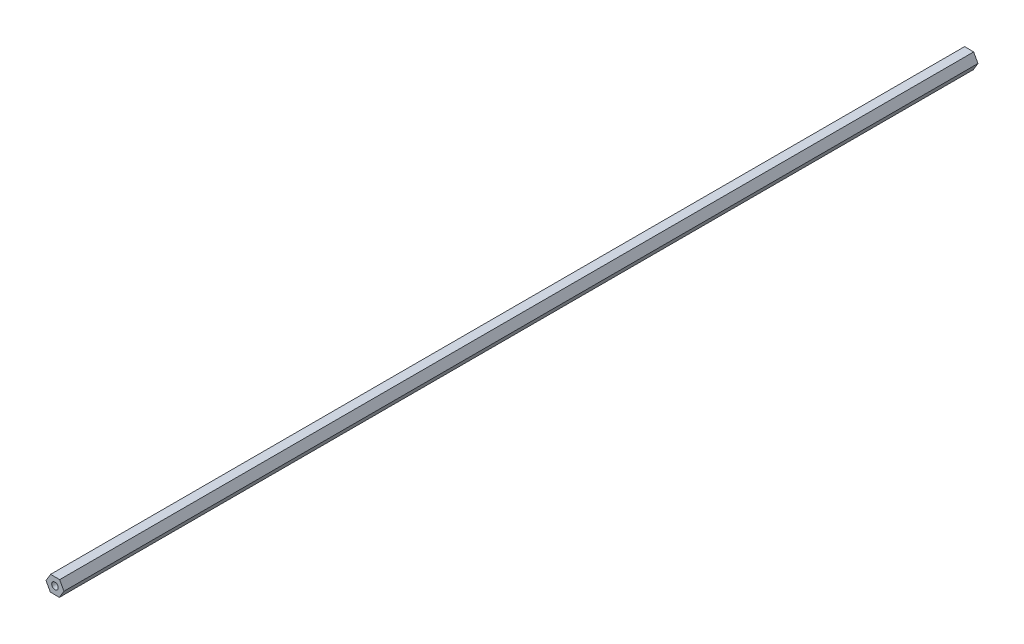
ISO-10303-21;
HEADER;
FILE_DESCRIPTION(('STEP AP214'),'2;1');
FILE_NAME('part.step','',(''),(''),'','','');
FILE_SCHEMA(('AUTOMOTIVE_DESIGN { 1 0 10303 214 1 1 1 1 }'));
ENDSEC;
DATA;
#1=APPLICATION_CONTEXT('core data for automotive mechanical design processes');
#2=APPLICATION_PROTOCOL_DEFINITION('international standard','automotive_design',2000,#1);
#3=PRODUCT_CONTEXT('',#1,'mechanical');
#4=PRODUCT('Part','Part','',(#3));
#5=PRODUCT_RELATED_PRODUCT_CATEGORY('part','',(#4));
#6=PRODUCT_DEFINITION_FORMATION('','',#4);
#7=PRODUCT_DEFINITION_CONTEXT('part definition',#1,'design');
#8=PRODUCT_DEFINITION('design','',#6,#7);
#9=PRODUCT_DEFINITION_SHAPE('','',#8);
#10=(LENGTH_UNIT() NAMED_UNIT(*) SI_UNIT(.MILLI.,.METRE.));
#11=(NAMED_UNIT(*) PLANE_ANGLE_UNIT() SI_UNIT($,.RADIAN.));
#12=(NAMED_UNIT(*) SI_UNIT($,.STERADIAN.) SOLID_ANGLE_UNIT());
#13=UNCERTAINTY_MEASURE_WITH_UNIT(LENGTH_MEASURE(1.E-05),#10,'distance_accuracy_value','');
#14=(GEOMETRIC_REPRESENTATION_CONTEXT(3) GLOBAL_UNCERTAINTY_ASSIGNED_CONTEXT((#13)) GLOBAL_UNIT_ASSIGNED_CONTEXT((#10,
#11,#12)) REPRESENTATION_CONTEXT('',''));
#15=CARTESIAN_POINT('',(0.,0.,0.));
#16=DIRECTION('',(0.,0.,1.));
#17=DIRECTION('',(1.,0.,0.));
#18=AXIS2_PLACEMENT_3D('',#15,#16,#17);
#19=CARTESIAN_POINT('',(0.,0.,746.76));
#20=DIRECTION('',(0.,0.,1.));
#21=DIRECTION('',(1.,0.,0.));
#22=AXIS2_PLACEMENT_3D('',#19,#20,#21);
#23=PLANE('',#22);
#24=DIRECTION('',(0.999847669317632,-0.0174538866760075,0.));
#25=VECTOR('',#24,1.);
#26=CARTESIAN_POINT('',(-3.77644791892778,-6.2850437109824,746.76));
#27=LINE('',#26,#25);
#28=CARTESIAN_POINT('',(-3.77644791892778,-6.2850437109824,746.76));
#29=VERTEX_POINT('',#28);
#30=CARTESIAN_POINT('',(3.55478355814249,-6.41302168935153,746.76));
#31=VERTEX_POINT('',#30);
#32=EDGE_CURVE('E152',#29,#31,#27,.T.);
#33=ORIENTED_EDGE('',*,*,#32,.T.);
#34=DIRECTION('',(0.515039343915013,0.857166538205729,0.));
#35=VECTOR('',#34,1.);
#36=CARTESIAN_POINT('',(3.55478355814249,-6.41302168935153,746.76));
#37=LINE('',#36,#35);
#38=CARTESIAN_POINT('',(7.33123147707026,-0.127977978369134,746.76));
#39=VERTEX_POINT('',#38);
#40=EDGE_CURVE('E100',#31,#39,#37,.T.);
#41=ORIENTED_EDGE('',*,*,#40,.T.);
#42=DIRECTION('',(-0.484808325402619,0.874620424881736,0.));
#43=VECTOR('',#42,1.);
#44=CARTESIAN_POINT('',(7.33123147707026,-0.127977978369134,746.76));
#45=LINE('',#44,#43);
#46=CARTESIAN_POINT('',(3.77644791892777,6.2850437109824,746.76));
#47=VERTEX_POINT('',#46);
#48=EDGE_CURVE('E113',#39,#47,#45,.T.);
#49=ORIENTED_EDGE('',*,*,#48,.T.);
#50=DIRECTION('',(-0.999847669317632,0.0174538866760075,0.));
#51=VECTOR('',#50,1.);
#52=CARTESIAN_POINT('',(3.77644791892777,6.2850437109824,746.76));
#53=LINE('',#52,#51);
#54=CARTESIAN_POINT('',(-3.55478355814248,6.41302168935153,746.76));
#55=VERTEX_POINT('',#54);
#56=EDGE_CURVE('E107',#47,#55,#53,.T.);
#57=ORIENTED_EDGE('',*,*,#56,.T.);
#58=DIRECTION('',(-0.515039343915014,-0.857166538205728,0.));
#59=VECTOR('',#58,1.);
#60=CARTESIAN_POINT('',(-3.55478355814248,6.41302168935153,746.76));
#61=LINE('',#60,#59);
#62=CARTESIAN_POINT('',(-7.33123147707027,0.127977978369134,746.76));
#63=VERTEX_POINT('',#62);
#64=EDGE_CURVE('E111',#55,#63,#61,.T.);
#65=ORIENTED_EDGE('',*,*,#64,.T.);
#66=DIRECTION('',(0.484808325402619,-0.874620424881736,0.));
#67=VECTOR('',#66,1.);
#68=CARTESIAN_POINT('',(-7.33123147707027,0.127977978369134,746.76));
#69=LINE('',#68,#67);
#70=EDGE_CURVE('E63',#63,#29,#69,.T.);
#71=ORIENTED_EDGE('',*,*,#70,.T.);
#72=EDGE_LOOP('',(#33,#41,#49,#57,#65,#71));
#73=FACE_BOUND('',#72,.T.);
#74=CARTESIAN_POINT('',(0.,0.,746.76));
#75=DIRECTION('',(0.,0.,1.));
#76=DIRECTION('',(1.,0.,0.));
#77=AXIS2_PLACEMENT_3D('',#74,#75,#76);
#78=CIRCLE('',#77,2.667);
#79=CARTESIAN_POINT('',(-2.667,0.,746.76));
#80=VERTEX_POINT('',#79);
#81=EDGE_CURVE('E140',#80,#80,#78,.T.);
#82=ORIENTED_EDGE('',*,*,#81,.F.);
#83=EDGE_LOOP('',(#82));
#84=FACE_BOUND('',#83,.T.);
#85=ADVANCED_FACE('F45',(#73,#84),#23,.T.);
#86=CARTESIAN_POINT('',(0.,0.,0.));
#87=DIRECTION('',(0.,0.,1.));
#88=DIRECTION('',(1.,0.,0.));
#89=AXIS2_PLACEMENT_3D('',#86,#87,#88);
#90=PLANE('',#89);
#91=DIRECTION('',(0.999847669317632,-0.0174538866760075,0.));
#92=VECTOR('',#91,1.);
#93=CARTESIAN_POINT('',(-3.77644791892778,-6.2850437109824,0.));
#94=LINE('',#93,#92);
#95=CARTESIAN_POINT('',(-3.77644791892778,-6.2850437109824,0.));
#96=VERTEX_POINT('',#95);
#97=CARTESIAN_POINT('',(3.55478355814249,-6.41302168935153,0.));
#98=VERTEX_POINT('',#97);
#99=EDGE_CURVE('E135',#96,#98,#94,.T.);
#100=ORIENTED_EDGE('',*,*,#99,.F.);
#101=DIRECTION('',(0.484808325402619,-0.874620424881736,0.));
#102=VECTOR('',#101,1.);
#103=CARTESIAN_POINT('',(-7.33123147707027,0.127977978369134,0.));
#104=LINE('',#103,#102);
#105=CARTESIAN_POINT('',(-7.33123147707027,0.127977978369134,0.));
#106=VERTEX_POINT('',#105);
#107=EDGE_CURVE('E92',#106,#96,#104,.T.);
#108=ORIENTED_EDGE('',*,*,#107,.F.);
#109=DIRECTION('',(-0.515039343915014,-0.857166538205728,0.));
#110=VECTOR('',#109,1.);
#111=CARTESIAN_POINT('',(-3.55478355814248,6.41302168935153,0.));
#112=LINE('',#111,#110);
#113=CARTESIAN_POINT('',(-3.55478355814248,6.41302168935153,0.));
#114=VERTEX_POINT('',#113);
#115=EDGE_CURVE('E86',#114,#106,#112,.T.);
#116=ORIENTED_EDGE('',*,*,#115,.F.);
#117=DIRECTION('',(-0.999847669317632,0.0174538866760075,0.));
#118=VECTOR('',#117,1.);
#119=CARTESIAN_POINT('',(3.77644791892777,6.2850437109824,0.));
#120=LINE('',#119,#118);
#121=CARTESIAN_POINT('',(3.77644791892777,6.2850437109824,0.));
#122=VERTEX_POINT('',#121);
#123=EDGE_CURVE('E122',#122,#114,#120,.T.);
#124=ORIENTED_EDGE('',*,*,#123,.F.);
#125=DIRECTION('',(-0.484808325402619,0.874620424881736,0.));
#126=VECTOR('',#125,1.);
#127=CARTESIAN_POINT('',(7.33123147707026,-0.127977978369134,0.));
#128=LINE('',#127,#126);
#129=CARTESIAN_POINT('',(7.33123147707026,-0.127977978369134,0.));
#130=VERTEX_POINT('',#129);
#131=EDGE_CURVE('E143',#130,#122,#128,.T.);
#132=ORIENTED_EDGE('',*,*,#131,.F.);
#133=DIRECTION('',(0.515039343915013,0.857166538205729,0.));
#134=VECTOR('',#133,1.);
#135=CARTESIAN_POINT('',(3.55478355814249,-6.41302168935153,0.));
#136=LINE('',#135,#134);
#137=EDGE_CURVE('E139',#98,#130,#136,.T.);
#138=ORIENTED_EDGE('',*,*,#137,.F.);
#139=EDGE_LOOP('',(#100,#108,#116,#124,#132,#138));
#140=FACE_BOUND('',#139,.T.);
#141=CARTESIAN_POINT('',(0.,0.,0.));
#142=DIRECTION('',(0.,0.,1.));
#143=DIRECTION('',(1.,0.,0.));
#144=AXIS2_PLACEMENT_3D('',#141,#142,#143);
#145=CIRCLE('',#144,2.667);
#146=CARTESIAN_POINT('',(-2.667,0.,0.));
#147=VERTEX_POINT('',#146);
#148=EDGE_CURVE('E249',#147,#147,#145,.T.);
#149=ORIENTED_EDGE('',*,*,#148,.T.);
#150=EDGE_LOOP('',(#149));
#151=FACE_BOUND('',#150,.T.);
#152=ADVANCED_FACE('F165',(#140,#151),#90,.F.);
#153=CARTESIAN_POINT('',(-3.77644791892778,-6.2850437109824,746.76));
#154=DIRECTION('',(0.0174538866760075,0.999847669317632,0.));
#155=DIRECTION('',(-0.999847669317632,0.0174538866760075,0.));
#156=AXIS2_PLACEMENT_3D('',#153,#154,#155);
#157=PLANE('',#156);
#158=ORIENTED_EDGE('',*,*,#99,.T.);
#159=DIRECTION('',(0.,0.,-1.));
#160=VECTOR('',#159,1.);
#161=CARTESIAN_POINT('',(3.55478355814249,-6.41302168935153,746.76));
#162=LINE('',#161,#160);
#163=EDGE_CURVE('E11',#31,#98,#162,.T.);
#164=ORIENTED_EDGE('',*,*,#163,.F.);
#165=ORIENTED_EDGE('',*,*,#32,.F.);
#166=DIRECTION('',(0.,0.,-1.));
#167=VECTOR('',#166,1.);
#168=CARTESIAN_POINT('',(-3.77644791892778,-6.2850437109824,746.76));
#169=LINE('',#168,#167);
#170=EDGE_CURVE('E131',#29,#96,#169,.T.);
#171=ORIENTED_EDGE('',*,*,#170,.T.);
#172=EDGE_LOOP('',(#158,#164,#165,#171));
#173=FACE_BOUND('',#172,.T.);
#174=ADVANCED_FACE('F47',(#173),#157,.F.);
#175=CARTESIAN_POINT('',(3.55478355814249,-6.41302168935153,746.76));
#176=DIRECTION('',(-0.857166538205729,0.515039343915013,0.));
#177=DIRECTION('',(-0.515039343915013,-0.857166538205729,0.));
#178=AXIS2_PLACEMENT_3D('',#175,#176,#177);
#179=PLANE('',#178);
#180=ORIENTED_EDGE('',*,*,#137,.T.);
#181=DIRECTION('',(0.,0.,-1.));
#182=VECTOR('',#181,1.);
#183=CARTESIAN_POINT('',(7.33123147707026,-0.127977978369134,746.76));
#184=LINE('',#183,#182);
#185=EDGE_CURVE('E55',#39,#130,#184,.T.);
#186=ORIENTED_EDGE('',*,*,#185,.F.);
#187=ORIENTED_EDGE('',*,*,#40,.F.);
#188=ORIENTED_EDGE('',*,*,#163,.T.);
#189=EDGE_LOOP('',(#180,#186,#187,#188));
#190=FACE_BOUND('',#189,.T.);
#191=ADVANCED_FACE('F190',(#190),#179,.F.);
#192=CARTESIAN_POINT('',(7.33123147707026,-0.127977978369134,746.76));
#193=DIRECTION('',(-0.874620424881736,-0.484808325402619,0.));
#194=DIRECTION('',(0.484808325402619,-0.874620424881736,0.));
#195=AXIS2_PLACEMENT_3D('',#192,#193,#194);
#196=PLANE('',#195);
#197=ORIENTED_EDGE('',*,*,#131,.T.);
#198=DIRECTION('',(0.,0.,-1.));
#199=VECTOR('',#198,1.);
#200=CARTESIAN_POINT('',(3.77644791892777,6.2850437109824,746.76));
#201=LINE('',#200,#199);
#202=EDGE_CURVE('E124',#47,#122,#201,.T.);
#203=ORIENTED_EDGE('',*,*,#202,.F.);
#204=ORIENTED_EDGE('',*,*,#48,.F.);
#205=ORIENTED_EDGE('',*,*,#185,.T.);
#206=EDGE_LOOP('',(#197,#203,#204,#205));
#207=FACE_BOUND('',#206,.T.);
#208=ADVANCED_FACE('F162',(#207),#196,.F.);
#209=CARTESIAN_POINT('',(3.77644791892777,6.2850437109824,746.76));
#210=DIRECTION('',(-0.0174538866760075,-0.999847669317632,0.));
#211=DIRECTION('',(0.999847669317632,-0.0174538866760075,0.));
#212=AXIS2_PLACEMENT_3D('',#209,#210,#211);
#213=PLANE('',#212);
#214=ORIENTED_EDGE('',*,*,#123,.T.);
#215=DIRECTION('',(0.,0.,-1.));
#216=VECTOR('',#215,1.);
#217=CARTESIAN_POINT('',(-3.55478355814248,6.41302168935153,746.76));
#218=LINE('',#217,#216);
#219=EDGE_CURVE('E119',#55,#114,#218,.T.);
#220=ORIENTED_EDGE('',*,*,#219,.F.);
#221=ORIENTED_EDGE('',*,*,#56,.F.);
#222=ORIENTED_EDGE('',*,*,#202,.T.);
#223=EDGE_LOOP('',(#214,#220,#221,#222));
#224=FACE_BOUND('',#223,.T.);
#225=ADVANCED_FACE('F120',(#224),#213,.F.);
#226=CARTESIAN_POINT('',(-3.55478355814248,6.41302168935153,746.76));
#227=DIRECTION('',(0.857166538205728,-0.515039343915014,0.));
#228=DIRECTION('',(0.515039343915014,0.857166538205728,0.));
#229=AXIS2_PLACEMENT_3D('',#226,#227,#228);
#230=PLANE('',#229);
#231=ORIENTED_EDGE('',*,*,#115,.T.);
#232=DIRECTION('',(0.,0.,-1.));
#233=VECTOR('',#232,1.);
#234=CARTESIAN_POINT('',(-7.33123147707027,0.127977978369134,746.76));
#235=LINE('',#234,#233);
#236=EDGE_CURVE('E125',#63,#106,#235,.T.);
#237=ORIENTED_EDGE('',*,*,#236,.F.);
#238=ORIENTED_EDGE('',*,*,#64,.F.);
#239=ORIENTED_EDGE('',*,*,#219,.T.);
#240=EDGE_LOOP('',(#231,#237,#238,#239));
#241=FACE_BOUND('',#240,.T.);
#242=ADVANCED_FACE('F127',(#241),#230,.F.);
#243=CARTESIAN_POINT('',(-7.33123147707027,0.127977978369134,746.76));
#244=DIRECTION('',(0.874620424881736,0.484808325402619,0.));
#245=DIRECTION('',(-0.484808325402619,0.874620424881736,0.));
#246=AXIS2_PLACEMENT_3D('',#243,#244,#245);
#247=PLANE('',#246);
#248=ORIENTED_EDGE('',*,*,#107,.T.);
#249=ORIENTED_EDGE('',*,*,#170,.F.);
#250=ORIENTED_EDGE('',*,*,#70,.F.);
#251=ORIENTED_EDGE('',*,*,#236,.T.);
#252=EDGE_LOOP('',(#248,#249,#250,#251));
#253=FACE_BOUND('',#252,.T.);
#254=ADVANCED_FACE('F170',(#253),#247,.F.);
#255=CARTESIAN_POINT('',(0.,0.,746.76));
#256=DIRECTION('',(0.,0.,-1.));
#257=DIRECTION('',(-1.,0.,0.));
#258=AXIS2_PLACEMENT_3D('',#255,#256,#257);
#259=CYLINDRICAL_SURFACE('',#258,2.667);
#260=CARTESIAN_POINT('',(-2.667,0.,746.76));
#261=CARTESIAN_POINT('',(-2.667,0.,738.98125));
#262=CARTESIAN_POINT('',(-2.667,0.,731.2025));
#263=CARTESIAN_POINT('',(-2.667,0.,715.645));
#264=CARTESIAN_POINT('',(-2.667,0.,707.86625));
#265=CARTESIAN_POINT('',(-2.667,0.,692.30875));
#266=CARTESIAN_POINT('',(-2.667,0.,684.53));
#267=CARTESIAN_POINT('',(-2.667,0.,668.9725));
#268=CARTESIAN_POINT('',(-2.667,0.,661.19375));
#269=CARTESIAN_POINT('',(-2.667,0.,645.63625));
#270=CARTESIAN_POINT('',(-2.667,0.,637.8575));
#271=CARTESIAN_POINT('',(-2.667,0.,622.3));
#272=CARTESIAN_POINT('',(-2.667,0.,614.52125));
#273=CARTESIAN_POINT('',(-2.667,0.,598.96375));
#274=CARTESIAN_POINT('',(-2.667,0.,591.185));
#275=CARTESIAN_POINT('',(-2.667,0.,575.6275));
#276=CARTESIAN_POINT('',(-2.667,0.,567.84875));
#277=CARTESIAN_POINT('',(-2.667,0.,552.29125));
#278=CARTESIAN_POINT('',(-2.667,0.,544.5125));
#279=CARTESIAN_POINT('',(-2.667,0.,528.955));
#280=CARTESIAN_POINT('',(-2.667,0.,521.17625));
#281=CARTESIAN_POINT('',(-2.667,0.,505.61875));
#282=CARTESIAN_POINT('',(-2.667,0.,497.84));
#283=CARTESIAN_POINT('',(-2.667,0.,482.2825));
#284=CARTESIAN_POINT('',(-2.667,0.,474.50375));
#285=CARTESIAN_POINT('',(-2.667,0.,458.94625));
#286=CARTESIAN_POINT('',(-2.667,0.,451.1675));
#287=CARTESIAN_POINT('',(-2.667,0.,435.61));
#288=CARTESIAN_POINT('',(-2.667,0.,427.83125));
#289=CARTESIAN_POINT('',(-2.667,0.,412.27375));
#290=CARTESIAN_POINT('',(-2.667,0.,404.495));
#291=CARTESIAN_POINT('',(-2.667,0.,388.9375));
#292=CARTESIAN_POINT('',(-2.667,0.,381.15875));
#293=CARTESIAN_POINT('',(-2.667,0.,365.60125));
#294=CARTESIAN_POINT('',(-2.667,0.,357.8225));
#295=CARTESIAN_POINT('',(-2.667,0.,342.265));
#296=CARTESIAN_POINT('',(-2.667,0.,334.48625));
#297=CARTESIAN_POINT('',(-2.667,0.,318.92875));
#298=CARTESIAN_POINT('',(-2.667,0.,311.15));
#299=CARTESIAN_POINT('',(-2.667,0.,295.5925));
#300=CARTESIAN_POINT('',(-2.667,0.,287.81375));
#301=CARTESIAN_POINT('',(-2.667,0.,272.25625));
#302=CARTESIAN_POINT('',(-2.667,0.,264.4775));
#303=CARTESIAN_POINT('',(-2.667,0.,248.92));
#304=CARTESIAN_POINT('',(-2.667,0.,241.14125));
#305=CARTESIAN_POINT('',(-2.667,0.,225.58375));
#306=CARTESIAN_POINT('',(-2.667,0.,217.805));
#307=CARTESIAN_POINT('',(-2.667,0.,202.2475));
#308=CARTESIAN_POINT('',(-2.667,0.,194.46875));
#309=CARTESIAN_POINT('',(-2.667,0.,178.91125));
#310=CARTESIAN_POINT('',(-2.667,0.,171.1325));
#311=CARTESIAN_POINT('',(-2.667,0.,155.575));
#312=CARTESIAN_POINT('',(-2.667,0.,147.79625));
#313=CARTESIAN_POINT('',(-2.667,0.,132.23875));
#314=CARTESIAN_POINT('',(-2.667,0.,124.46));
#315=CARTESIAN_POINT('',(-2.667,0.,108.9025));
#316=CARTESIAN_POINT('',(-2.667,0.,101.12375));
#317=CARTESIAN_POINT('',(-2.667,0.,85.56625));
#318=CARTESIAN_POINT('',(-2.667,0.,77.7875));
#319=CARTESIAN_POINT('',(-2.667,0.,62.23));
#320=CARTESIAN_POINT('',(-2.667,0.,54.45125));
#321=CARTESIAN_POINT('',(-2.667,0.,38.89375));
#322=CARTESIAN_POINT('',(-2.667,0.,31.115));
#323=CARTESIAN_POINT('',(-2.667,0.,15.5575));
#324=CARTESIAN_POINT('',(-2.667,0.,7.77875000000002));
#325=CARTESIAN_POINT('',(-2.667,0.,0.));
#326=B_SPLINE_CURVE_WITH_KNOTS('',3,(#260,#261,#262,#263,#264,#265,#266,#267,#268,#269,#270,
#271,#272,#273,#274,#275,#276,#277,#278,#279,#280,#281,#282,#283,#284,#285,#286,#287,#288,#289,
#290,#291,#292,#293,#294,#295,#296,#297,#298,#299,#300,#301,#302,#303,#304,#305,#306,#307,#308,
#309,#310,#311,#312,#313,#314,#315,#316,#317,#318,#319,#320,#321,#322,#323,#324,#325),
.UNSPECIFIED.,.F.,.F.,(4,2,2,2,2,2,2,2,2,2,2,2,2,2,2,2,2,2,2,2,2,2,2,2,2,2,2,2,2,2,2,2,4),(0.,
23.3362500000001,46.6725,70.0087500000001,93.345,116.68125,140.0175,163.35375,186.69,210.02625,
233.3625,256.69875,280.035,303.37125,326.7075,350.04375,373.38,396.71625,420.0525,443.38875,
466.725,490.06125,513.3975,536.73375,560.07,583.40625,606.7425,630.07875,653.415,676.75125,
700.0875,723.42375,746.76),.UNSPECIFIED.);
#327=EDGE_CURVE('BSEAM172',#80,#147,#326,.T.);
#328=ORIENTED_EDGE('',*,*,#81,.T.);
#329=ORIENTED_EDGE('',*,*,#148,.F.);
#330=ORIENTED_EDGE('',*,*,#327,.T.);
#331=ORIENTED_EDGE('',*,*,#327,.F.);
#332=EDGE_LOOP('',(#328,#330,#329,#331));
#333=FACE_BOUND('',#332,.T.);
#334=ADVANCED_FACE('F172',(#333),#259,.F.);
#335=CLOSED_SHELL('',(#85,#152,#174,#191,#208,#225,#242,#254,#334));
#336=MANIFOLD_SOLID_BREP('B2',#335);
#337=ADVANCED_BREP_SHAPE_REPRESENTATION('',(#18,#336),#14);
#338=SHAPE_DEFINITION_REPRESENTATION(#9,#337);
ENDSEC;
END-ISO-10303-21;
